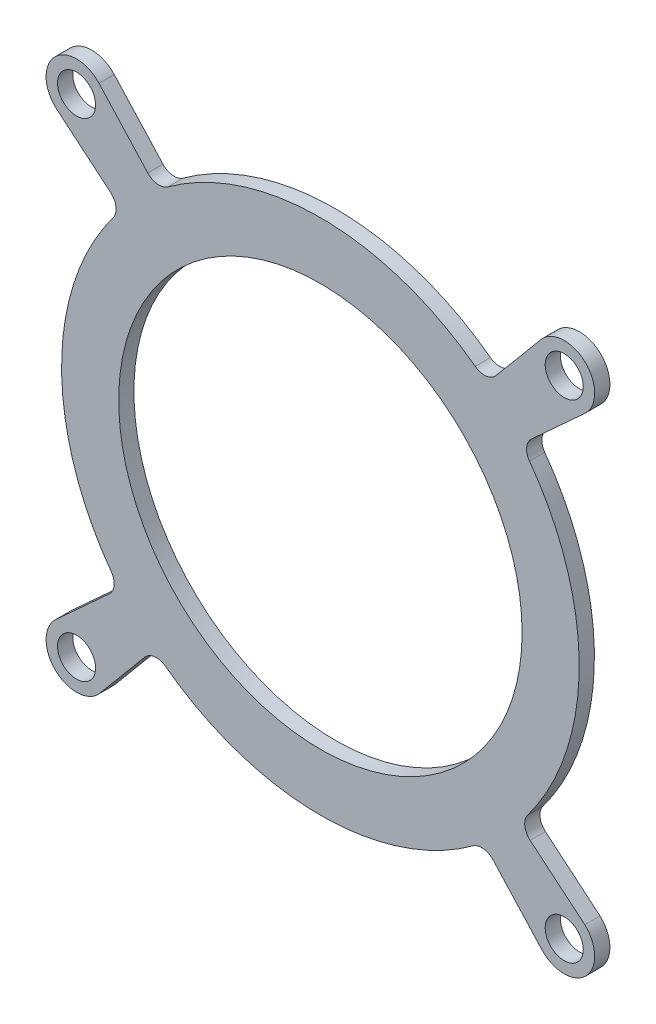
ISO-10303-21;
HEADER;
FILE_DESCRIPTION(('STEP AP214'),'2;1');
FILE_NAME('part.step','',(''),(''),'','','');
FILE_SCHEMA(('AUTOMOTIVE_DESIGN { 1 0 10303 214 1 1 1 1 }'));
ENDSEC;
DATA;
#1=APPLICATION_CONTEXT('core data for automotive mechanical design processes');
#2=APPLICATION_PROTOCOL_DEFINITION('international standard','automotive_design',2000,#1);
#3=PRODUCT_CONTEXT('',#1,'mechanical');
#4=PRODUCT('Part','Part','',(#3));
#5=PRODUCT_RELATED_PRODUCT_CATEGORY('part','',(#4));
#6=PRODUCT_DEFINITION_FORMATION('','',#4);
#7=PRODUCT_DEFINITION_CONTEXT('part definition',#1,'design');
#8=PRODUCT_DEFINITION('design','',#6,#7);
#9=PRODUCT_DEFINITION_SHAPE('','',#8);
#10=(LENGTH_UNIT() NAMED_UNIT(*) SI_UNIT(.MILLI.,.METRE.));
#11=(NAMED_UNIT(*) PLANE_ANGLE_UNIT() SI_UNIT($,.RADIAN.));
#12=(NAMED_UNIT(*) SI_UNIT($,.STERADIAN.) SOLID_ANGLE_UNIT());
#13=UNCERTAINTY_MEASURE_WITH_UNIT(LENGTH_MEASURE(1.E-05),#10,'distance_accuracy_value','');
#14=(GEOMETRIC_REPRESENTATION_CONTEXT(3) GLOBAL_UNCERTAINTY_ASSIGNED_CONTEXT((#13)) GLOBAL_UNIT_ASSIGNED_CONTEXT((#10,
#11,#12)) REPRESENTATION_CONTEXT('',''));
#15=CARTESIAN_POINT('',(0.,0.,0.));
#16=DIRECTION('',(0.,0.,1.));
#17=DIRECTION('',(1.,0.,0.));
#18=AXIS2_PLACEMENT_3D('',#15,#16,#17);
#19=CARTESIAN_POINT('',(32.0354727216565,-31.5983298645137,2.));
#20=DIRECTION('',(0.,0.,1.));
#21=DIRECTION('',(1.,0.,0.));
#22=AXIS2_PLACEMENT_3D('',#19,#20,#21);
#23=PLANE('',#22);
#24=CARTESIAN_POINT('',(32.0354727216543,32.4726155787952,2.));
#25=DIRECTION('',(0.,0.,1.));
#26=DIRECTION('',(1.,0.,0.));
#27=AXIS2_PLACEMENT_3D('',#24,#25,#26);
#28=CIRCLE('',#27,2.5000000000029);
#29=CARTESIAN_POINT('',(34.5354727216572,32.4726155787952,2.));
#30=VERTEX_POINT('',#29);
#31=EDGE_CURVE('E528',#30,#30,#28,.T.);
#32=ORIENTED_EDGE('',*,*,#31,.F.);
#33=EDGE_LOOP('',(#32));
#34=FACE_BOUND('',#33,.T.);
#35=CARTESIAN_POINT('',(-32.0354727216524,-31.5983298645159,2.));
#36=DIRECTION('',(0.,0.,1.));
#37=DIRECTION('',(1.,0.,0.));
#38=AXIS2_PLACEMENT_3D('',#35,#36,#37);
#39=CIRCLE('',#38,2.49999999999642);
#40=CARTESIAN_POINT('',(-29.535472721656,-31.5983298645159,2.));
#41=VERTEX_POINT('',#40);
#42=EDGE_CURVE('E544',#41,#41,#39,.T.);
#43=ORIENTED_EDGE('',*,*,#42,.F.);
#44=EDGE_LOOP('',(#43));
#45=FACE_BOUND('',#44,.T.);
#46=CARTESIAN_POINT('',(32.0354727216565,-31.5983298645137,2.));
#47=DIRECTION('',(0.,0.,1.));
#48=DIRECTION('',(1.,0.,0.));
#49=AXIS2_PLACEMENT_3D('',#46,#47,#48);
#50=CIRCLE('',#49,4.00000000000003);
#51=CARTESIAN_POINT('',(29.0849413750936,-34.2991380348491,2.));
#52=VERTEX_POINT('',#51);
#53=CARTESIAN_POINT('',(34.7362808919919,-28.6477985179509,2.));
#54=VERTEX_POINT('',#53);
#55=EDGE_CURVE('E308',#52,#54,#50,.T.);
#56=ORIENTED_EDGE('',*,*,#55,.T.);
#57=DIRECTION('',(-0.766720690696215,0.641980827173459,0.));
#58=VECTOR('',#57,1.);
#59=CARTESIAN_POINT('',(34.7362808919919,-28.6477985179509,2.));
#60=LINE('',#59,#58);
#61=CARTESIAN_POINT('',(27.5593163533478,-22.6384737572881,2.));
#62=VERTEX_POINT('',#61);
#63=EDGE_CURVE('E148',#54,#62,#60,.T.);
#64=ORIENTED_EDGE('',*,*,#63,.T.);
#65=CARTESIAN_POINT('',(28.8432780076946,-21.1050323758959,2.));
#66=DIRECTION('',(0.,0.,-1.));
#67=DIRECTION('',(-1.,0.,0.));
#68=AXIS2_PLACEMENT_3D('',#65,#66,#67);
#69=CIRCLE('',#68,1.99999999999966);
#70=CARTESIAN_POINT('',(27.2408736739341,-19.9082448629495,2.));
#71=VERTEX_POINT('',#70);
#72=EDGE_CURVE('E393',#62,#71,#69,.T.);
#73=ORIENTED_EDGE('',*,*,#72,.T.);
#74=CARTESIAN_POINT('',(9.99200722162641E-13,0.437142857142837,2.));
#75=DIRECTION('',(0.,0.,1.));
#76=DIRECTION('',(1.,0.,0.));
#77=AXIS2_PLACEMENT_3D('',#74,#75,#76);
#78=CIRCLE('',#77,34.000000000001);
#79=CARTESIAN_POINT('',(27.4749871011398,20.4652502013809,2.));
#80=VERTEX_POINT('',#79);
#81=EDGE_CURVE('E413',#71,#80,#78,.T.);
#82=ORIENTED_EDGE('',*,*,#81,.T.);
#83=CARTESIAN_POINT('',(29.0911628129714,21.6433741628067,2.));
#84=DIRECTION('',(0.,0.,-1.));
#85=DIRECTION('',(1.,0.,0.));
#86=AXIS2_PLACEMENT_3D('',#83,#84,#85);
#87=CIRCLE('',#86,1.99999999999999);
#88=CARTESIAN_POINT('',(27.7407587278038,23.1186398360881,2.));
#89=VERTEX_POINT('',#88);
#90=EDGE_CURVE('E409',#80,#89,#87,.T.);
#91=ORIENTED_EDGE('',*,*,#90,.T.);
#92=DIRECTION('',(0.7376328366407,0.675202042583843,0.));
#93=VECTOR('',#92,1.);
#94=CARTESIAN_POINT('',(34.7362808919891,29.5220842322318,2.));
#95=LINE('',#94,#93);
#96=CARTESIAN_POINT('',(34.7362808919891,29.5220842322318,2.));
#97=VERTEX_POINT('',#96);
#98=EDGE_CURVE('E412',#89,#97,#95,.T.);
#99=ORIENTED_EDGE('',*,*,#98,.T.);
#100=CARTESIAN_POINT('',(32.0354727216462,32.4726155787877,2.));
#101=DIRECTION('',(0.,0.,1.));
#102=DIRECTION('',(1.,0.,0.));
#103=AXIS2_PLACEMENT_3D('',#100,#101,#102);
#104=CIRCLE('',#103,4.00000000000003);
#105=CARTESIAN_POINT('',(29.0849413750908,35.1734237491312,2.));
#106=VERTEX_POINT('',#105);
#107=EDGE_CURVE('E417',#97,#106,#104,.T.);
#108=ORIENTED_EDGE('',*,*,#107,.T.);
#109=DIRECTION('',(-0.641980827173504,-0.766720690696178,0.));
#110=VECTOR('',#109,1.);
#111=CARTESIAN_POINT('',(29.0849413750908,35.1734237491312,2.));
#112=LINE('',#111,#110);
#113=CARTESIAN_POINT('',(23.0756166144313,27.9964592104921,2.));
#114=VERTEX_POINT('',#113);
#115=EDGE_CURVE('E424',#106,#114,#112,.T.);
#116=ORIENTED_EDGE('',*,*,#115,.T.);
#117=CARTESIAN_POINT('',(21.5421752330389,29.280420864839,2.));
#118=DIRECTION('',(0.,0.,-1.));
#119=DIRECTION('',(-1.,0.,0.));
#120=AXIS2_PLACEMENT_3D('',#117,#118,#119);
#121=CIRCLE('',#120,2.);
#122=CARTESIAN_POINT('',(20.3453877200923,27.6780165310783,2.));
#123=VERTEX_POINT('',#122);
#124=EDGE_CURVE('E427',#114,#123,#121,.T.);
#125=ORIENTED_EDGE('',*,*,#124,.T.);
#126=CARTESIAN_POINT('',(3.23767156700697E-13,0.437142857144609,2.));
#127=DIRECTION('',(0.,0.,1.));
#128=DIRECTION('',(1.,0.,0.));
#129=AXIS2_PLACEMENT_3D('',#126,#127,#128);
#130=CIRCLE('',#129,34.0000000000012);
#131=CARTESIAN_POINT('',(-20.0281073442409,27.9121299582814,2.));
#132=VERTEX_POINT('',#131);
#133=EDGE_CURVE('E430',#123,#132,#130,.T.);
#134=ORIENTED_EDGE('',*,*,#133,.T.);
#135=CARTESIAN_POINT('',(-21.2062313056668,29.5283056701129,2.));
#136=DIRECTION('',(0.,0.,-1.));
#137=DIRECTION('',(1.,0.,0.));
#138=AXIS2_PLACEMENT_3D('',#135,#136,#137);
#139=CIRCLE('',#138,1.99999999999998);
#140=CARTESIAN_POINT('',(-22.6814969789482,28.1779015849453,2.));
#141=VERTEX_POINT('',#140);
#142=EDGE_CURVE('E433',#132,#141,#139,.T.);
#143=ORIENTED_EDGE('',*,*,#142,.T.);
#144=DIRECTION('',(-0.675202042583903,0.737632836640645,0.));
#145=VECTOR('',#144,1.);
#146=CARTESIAN_POINT('',(-29.0849413750926,35.1734237491302,2.));
#147=LINE('',#146,#145);
#148=CARTESIAN_POINT('',(-29.0849413750925,35.1734237491302,2.));
#149=VERTEX_POINT('',#148);
#150=EDGE_CURVE('E436',#141,#149,#147,.T.);
#151=ORIENTED_EDGE('',*,*,#150,.T.);
#152=CARTESIAN_POINT('',(-32.035472721681,32.4726155788198,2.));
#153=DIRECTION('',(0.,0.,1.));
#154=DIRECTION('',(1.,0.,0.));
#155=AXIS2_PLACEMENT_3D('',#152,#153,#154);
#156=CIRCLE('',#155,4.00000000000205);
#157=CARTESIAN_POINT('',(-34.7362808919923,29.5220842322322,2.));
#158=VERTEX_POINT('',#157);
#159=EDGE_CURVE('E439',#149,#158,#156,.T.);
#160=ORIENTED_EDGE('',*,*,#159,.T.);
#161=DIRECTION('',(0.76672069069621,-0.641980827173466,0.));
#162=VECTOR('',#161,1.);
#163=CARTESIAN_POINT('',(-34.7362808919923,29.5220842322322,2.));
#164=LINE('',#163,#162);
#165=CARTESIAN_POINT('',(-27.5593163533485,23.5127594715695,2.));
#166=VERTEX_POINT('',#165);
#167=EDGE_CURVE('E442',#158,#166,#164,.T.);
#168=ORIENTED_EDGE('',*,*,#167,.T.);
#169=CARTESIAN_POINT('',(-28.8432780076955,21.9793180901771,2.));
#170=DIRECTION('',(0.,0.,-1.));
#171=DIRECTION('',(-1.,0.,0.));
#172=AXIS2_PLACEMENT_3D('',#169,#170,#171);
#173=CIRCLE('',#172,2.00000000000002);
#174=CARTESIAN_POINT('',(-27.2408736739342,20.7825305772304,2.));
#175=VERTEX_POINT('',#174);
#176=EDGE_CURVE('E445',#166,#175,#173,.T.);
#177=ORIENTED_EDGE('',*,*,#176,.T.);
#178=CARTESIAN_POINT('',(7.35522753814166E-13,0.437142857142837,2.));
#179=DIRECTION('',(0.,0.,1.));
#180=DIRECTION('',(1.,0.,0.));
#181=AXIS2_PLACEMENT_3D('',#178,#179,#180);
#182=CIRCLE('',#181,33.9999999999996);
#183=CARTESIAN_POINT('',(-27.474987101134,-19.5909644870978,2.));
#184=VERTEX_POINT('',#183);
#185=EDGE_CURVE('E448',#175,#184,#182,.T.);
#186=ORIENTED_EDGE('',*,*,#185,.T.);
#187=CARTESIAN_POINT('',(-29.0911628129655,-20.7690884485238,2.));
#188=DIRECTION('',(0.,0.,-1.));
#189=DIRECTION('',(1.,0.,0.));
#190=AXIS2_PLACEMENT_3D('',#187,#188,#189);
#191=CIRCLE('',#190,2.);
#192=CARTESIAN_POINT('',(-27.7407587277978,-22.2443541218052,2.));
#193=VERTEX_POINT('',#192);
#194=EDGE_CURVE('E451',#184,#193,#191,.T.);
#195=ORIENTED_EDGE('',*,*,#194,.T.);
#196=DIRECTION('',(-0.737632836640711,-0.675202042583831,0.));
#197=VECTOR('',#196,1.);
#198=CARTESIAN_POINT('',(-34.7362808919889,-28.647798517954,2.));
#199=LINE('',#198,#197);
#200=CARTESIAN_POINT('',(-34.7362808919889,-28.6477985179541,2.));
#201=VERTEX_POINT('',#200);
#202=EDGE_CURVE('E454',#193,#201,#199,.T.);
#203=ORIENTED_EDGE('',*,*,#202,.T.);
#204=CARTESIAN_POINT('',(-32.0354727216524,-31.5983298645159,2.));
#205=DIRECTION('',(0.,0.,1.));
#206=DIRECTION('',(1.,0.,0.));
#207=AXIS2_PLACEMENT_3D('',#204,#205,#206);
#208=CIRCLE('',#207,4.00000000000007);
#209=CARTESIAN_POINT('',(-29.0849413750896,-34.2991380348513,2.));
#210=VERTEX_POINT('',#209);
#211=EDGE_CURVE('E457',#201,#210,#208,.T.);
#212=ORIENTED_EDGE('',*,*,#211,.T.);
#213=DIRECTION('',(0.641980827173464,0.766720690696211,0.));
#214=VECTOR('',#213,1.);
#215=CARTESIAN_POINT('',(-29.0849413750896,-34.2991380348513,2.));
#216=LINE('',#215,#214);
#217=CARTESIAN_POINT('',(-23.0756166144263,-27.1221734962068,2.));
#218=VERTEX_POINT('',#217);
#219=EDGE_CURVE('E460',#210,#218,#216,.T.);
#220=ORIENTED_EDGE('',*,*,#219,.T.);
#221=CARTESIAN_POINT('',(-21.5421752330338,-28.4061351505537,2.));
#222=DIRECTION('',(0.,0.,-1.));
#223=DIRECTION('',(-1.,0.,0.));
#224=AXIS2_PLACEMENT_3D('',#221,#222,#223);
#225=CIRCLE('',#224,2.00000000000001);
#226=CARTESIAN_POINT('',(-20.3453877200875,-26.8037308167928,2.));
#227=VERTEX_POINT('',#226);
#228=EDGE_CURVE('E215',#218,#227,#225,.T.);
#229=ORIENTED_EDGE('',*,*,#228,.T.);
#230=CARTESIAN_POINT('',(0.,0.437142857143018,2.));
#231=DIRECTION('',(0.,0.,1.));
#232=DIRECTION('',(1.,0.,0.));
#233=AXIS2_PLACEMENT_3D('',#230,#231,#232);
#234=CIRCLE('',#233,34.0000000000002);
#235=CARTESIAN_POINT('',(20.0281073442381,-27.0378442439947,2.));
#236=VERTEX_POINT('',#235);
#237=EDGE_CURVE('E209',#227,#236,#234,.T.);
#238=ORIENTED_EDGE('',*,*,#237,.T.);
#239=CARTESIAN_POINT('',(21.2062313056639,-28.6540199558263,2.));
#240=DIRECTION('',(0.,0.,-1.));
#241=DIRECTION('',(1.,0.,0.));
#242=AXIS2_PLACEMENT_3D('',#239,#240,#241);
#243=CIRCLE('',#242,2.);
#244=CARTESIAN_POINT('',(22.6814969789453,-27.3036158706586,2.));
#245=VERTEX_POINT('',#244);
#246=EDGE_CURVE('E213',#236,#245,#243,.T.);
#247=ORIENTED_EDGE('',*,*,#246,.T.);
#248=DIRECTION('',(0.675202042583839,-0.737632836640704,0.));
#249=VECTOR('',#248,1.);
#250=CARTESIAN_POINT('',(29.0849413750936,-34.2991380348491,2.));
#251=LINE('',#250,#249);
#252=EDGE_CURVE('E57',#245,#52,#251,.T.);
#253=ORIENTED_EDGE('',*,*,#252,.T.);
#254=EDGE_LOOP('',(#56,#64,#73,#82,#91,#99,#108,#116,#125,#134,#143,#151,#160,#168,#177,#186,
#195,#203,#212,#220,#229,#238,#247,#253));
#255=FACE_BOUND('',#254,.T.);
#256=CARTESIAN_POINT('',(32.0354727216565,-31.5983298645137,2.));
#257=DIRECTION('',(0.,0.,1.));
#258=DIRECTION('',(1.,0.,0.));
#259=AXIS2_PLACEMENT_3D('',#256,#257,#258);
#260=CIRCLE('',#259,2.5);
#261=CARTESIAN_POINT('',(34.5354727216565,-31.5983298645137,2.));
#262=VERTEX_POINT('',#261);
#263=EDGE_CURVE('E242',#262,#262,#260,.T.);
#264=ORIENTED_EDGE('',*,*,#263,.F.);
#265=EDGE_LOOP('',(#264));
#266=FACE_BOUND('',#265,.T.);
#267=CARTESIAN_POINT('',(-32.0354727216546,32.4726155787929,2.));
#268=DIRECTION('',(0.,0.,1.));
#269=DIRECTION('',(1.,0.,0.));
#270=AXIS2_PLACEMENT_3D('',#267,#268,#269);
#271=CIRCLE('',#270,2.4999999999996);
#272=CARTESIAN_POINT('',(-29.535472721655,32.4726155787929,2.));
#273=VERTEX_POINT('',#272);
#274=EDGE_CURVE('E536',#273,#273,#271,.T.);
#275=ORIENTED_EDGE('',*,*,#274,.F.);
#276=EDGE_LOOP('',(#275));
#277=FACE_BOUND('',#276,.T.);
#278=CARTESIAN_POINT('',(3.23767156700697E-13,0.437142857144609,2.));
#279=DIRECTION('',(0.,0.,1.));
#280=DIRECTION('',(1.,0.,0.));
#281=AXIS2_PLACEMENT_3D('',#278,#279,#280);
#282=CIRCLE('',#281,26.5);
#283=CARTESIAN_POINT('',(26.5000000000003,0.437142857144609,2.));
#284=VERTEX_POINT('',#283);
#285=EDGE_CURVE('E517',#284,#284,#282,.T.);
#286=ORIENTED_EDGE('',*,*,#285,.F.);
#287=EDGE_LOOP('',(#286));
#288=FACE_BOUND('',#287,.T.);
#289=ADVANCED_FACE('F39',(#34,#45,#255,#266,#277,#288),#23,.T.);
#290=CARTESIAN_POINT('',(32.0354727216565,-31.5983298645137,0.));
#291=DIRECTION('',(0.,0.,1.));
#292=DIRECTION('',(1.,0.,0.));
#293=AXIS2_PLACEMENT_3D('',#290,#291,#292);
#294=PLANE('',#293);
#295=CARTESIAN_POINT('',(32.0354727216565,-31.5983298645137,0.));
#296=DIRECTION('',(0.,0.,1.));
#297=DIRECTION('',(1.,0.,0.));
#298=AXIS2_PLACEMENT_3D('',#295,#296,#297);
#299=CIRCLE('',#298,4.00000000000003);
#300=CARTESIAN_POINT('',(29.0849413750936,-34.2991380348491,0.));
#301=VERTEX_POINT('',#300);
#302=CARTESIAN_POINT('',(34.7362808919919,-28.6477985179509,0.));
#303=VERTEX_POINT('',#302);
#304=EDGE_CURVE('E237',#301,#303,#299,.T.);
#305=ORIENTED_EDGE('',*,*,#304,.F.);
#306=DIRECTION('',(0.675202042583839,-0.737632836640704,0.));
#307=VECTOR('',#306,1.);
#308=CARTESIAN_POINT('',(29.0849413750936,-34.2991380348491,0.));
#309=LINE('',#308,#307);
#310=CARTESIAN_POINT('',(22.6814969789453,-27.3036158706586,0.));
#311=VERTEX_POINT('',#310);
#312=EDGE_CURVE('E140',#311,#301,#309,.T.);
#313=ORIENTED_EDGE('',*,*,#312,.F.);
#314=CARTESIAN_POINT('',(21.2062313056639,-28.6540199558263,0.));
#315=DIRECTION('',(0.,0.,-1.));
#316=DIRECTION('',(1.,0.,0.));
#317=AXIS2_PLACEMENT_3D('',#314,#315,#316);
#318=CIRCLE('',#317,2.);
#319=CARTESIAN_POINT('',(20.0281073442381,-27.0378442439947,0.));
#320=VERTEX_POINT('',#319);
#321=EDGE_CURVE('E134',#320,#311,#318,.T.);
#322=ORIENTED_EDGE('',*,*,#321,.F.);
#323=CARTESIAN_POINT('',(0.,0.437142857143018,0.));
#324=DIRECTION('',(0.,0.,1.));
#325=DIRECTION('',(1.,0.,0.));
#326=AXIS2_PLACEMENT_3D('',#323,#324,#325);
#327=CIRCLE('',#326,34.0000000000002);
#328=CARTESIAN_POINT('',(-20.3453877200875,-26.8037308167928,0.));
#329=VERTEX_POINT('',#328);
#330=EDGE_CURVE('E224',#329,#320,#327,.T.);
#331=ORIENTED_EDGE('',*,*,#330,.F.);
#332=CARTESIAN_POINT('',(-21.5421752330338,-28.4061351505537,0.));
#333=DIRECTION('',(0.,0.,-1.));
#334=DIRECTION('',(-1.,0.,0.));
#335=AXIS2_PLACEMENT_3D('',#332,#333,#334);
#336=CIRCLE('',#335,2.00000000000001);
#337=CARTESIAN_POINT('',(-23.0756166144263,-27.1221734962068,0.));
#338=VERTEX_POINT('',#337);
#339=EDGE_CURVE('E299',#338,#329,#336,.T.);
#340=ORIENTED_EDGE('',*,*,#339,.F.);
#341=DIRECTION('',(0.641980827173464,0.766720690696211,0.));
#342=VECTOR('',#341,1.);
#343=CARTESIAN_POINT('',(-29.0849413750896,-34.2991380348513,0.));
#344=LINE('',#343,#342);
#345=CARTESIAN_POINT('',(-29.0849413750896,-34.2991380348513,0.));
#346=VERTEX_POINT('',#345);
#347=EDGE_CURVE('E296',#346,#338,#344,.T.);
#348=ORIENTED_EDGE('',*,*,#347,.F.);
#349=CARTESIAN_POINT('',(-32.0354727216524,-31.5983298645159,0.));
#350=DIRECTION('',(0.,0.,1.));
#351=DIRECTION('',(1.,0.,0.));
#352=AXIS2_PLACEMENT_3D('',#349,#350,#351);
#353=CIRCLE('',#352,4.00000000000007);
#354=CARTESIAN_POINT('',(-34.7362808919889,-28.6477985179541,0.));
#355=VERTEX_POINT('',#354);
#356=EDGE_CURVE('E293',#355,#346,#353,.T.);
#357=ORIENTED_EDGE('',*,*,#356,.F.);
#358=DIRECTION('',(-0.737632836640711,-0.675202042583831,0.));
#359=VECTOR('',#358,1.);
#360=CARTESIAN_POINT('',(-34.7362808919889,-28.647798517954,0.));
#361=LINE('',#360,#359);
#362=CARTESIAN_POINT('',(-27.7407587277978,-22.2443541218052,0.));
#363=VERTEX_POINT('',#362);
#364=EDGE_CURVE('E290',#363,#355,#361,.T.);
#365=ORIENTED_EDGE('',*,*,#364,.F.);
#366=CARTESIAN_POINT('',(-29.0911628129655,-20.7690884485238,0.));
#367=DIRECTION('',(0.,0.,-1.));
#368=DIRECTION('',(1.,0.,0.));
#369=AXIS2_PLACEMENT_3D('',#366,#367,#368);
#370=CIRCLE('',#369,2.);
#371=CARTESIAN_POINT('',(-27.474987101134,-19.5909644870978,0.));
#372=VERTEX_POINT('',#371);
#373=EDGE_CURVE('E287',#372,#363,#370,.T.);
#374=ORIENTED_EDGE('',*,*,#373,.F.);
#375=CARTESIAN_POINT('',(7.35522753814166E-13,0.437142857142837,0.));
#376=DIRECTION('',(0.,0.,1.));
#377=DIRECTION('',(1.,0.,0.));
#378=AXIS2_PLACEMENT_3D('',#375,#376,#377);
#379=CIRCLE('',#378,33.9999999999996);
#380=CARTESIAN_POINT('',(-27.2408736739342,20.7825305772304,0.));
#381=VERTEX_POINT('',#380);
#382=EDGE_CURVE('E284',#381,#372,#379,.T.);
#383=ORIENTED_EDGE('',*,*,#382,.F.);
#384=CARTESIAN_POINT('',(-28.8432780076955,21.9793180901771,0.));
#385=DIRECTION('',(0.,0.,-1.));
#386=DIRECTION('',(-1.,0.,0.));
#387=AXIS2_PLACEMENT_3D('',#384,#385,#386);
#388=CIRCLE('',#387,2.00000000000002);
#389=CARTESIAN_POINT('',(-27.5593163533485,23.5127594715695,0.));
#390=VERTEX_POINT('',#389);
#391=EDGE_CURVE('E281',#390,#381,#388,.T.);
#392=ORIENTED_EDGE('',*,*,#391,.F.);
#393=DIRECTION('',(0.76672069069621,-0.641980827173466,0.));
#394=VECTOR('',#393,1.);
#395=CARTESIAN_POINT('',(-34.7362808919923,29.5220842322322,0.));
#396=LINE('',#395,#394);
#397=CARTESIAN_POINT('',(-34.7362808919923,29.5220842322322,0.));
#398=VERTEX_POINT('',#397);
#399=EDGE_CURVE('E278',#398,#390,#396,.T.);
#400=ORIENTED_EDGE('',*,*,#399,.F.);
#401=CARTESIAN_POINT('',(-32.035472721681,32.4726155788198,0.));
#402=DIRECTION('',(0.,0.,1.));
#403=DIRECTION('',(1.,0.,0.));
#404=AXIS2_PLACEMENT_3D('',#401,#402,#403);
#405=CIRCLE('',#404,4.00000000000205);
#406=CARTESIAN_POINT('',(-29.0849413750925,35.1734237491302,0.));
#407=VERTEX_POINT('',#406);
#408=EDGE_CURVE('E275',#407,#398,#405,.T.);
#409=ORIENTED_EDGE('',*,*,#408,.F.);
#410=DIRECTION('',(-0.675202042583903,0.737632836640645,0.));
#411=VECTOR('',#410,1.);
#412=CARTESIAN_POINT('',(-29.0849413750926,35.1734237491302,0.));
#413=LINE('',#412,#411);
#414=CARTESIAN_POINT('',(-22.6814969789482,28.1779015849453,0.));
#415=VERTEX_POINT('',#414);
#416=EDGE_CURVE('E272',#415,#407,#413,.T.);
#417=ORIENTED_EDGE('',*,*,#416,.F.);
#418=CARTESIAN_POINT('',(-21.2062313056668,29.5283056701129,0.));
#419=DIRECTION('',(0.,0.,-1.));
#420=DIRECTION('',(1.,0.,0.));
#421=AXIS2_PLACEMENT_3D('',#418,#419,#420);
#422=CIRCLE('',#421,1.99999999999998);
#423=CARTESIAN_POINT('',(-20.0281073442409,27.9121299582814,0.));
#424=VERTEX_POINT('',#423);
#425=EDGE_CURVE('E269',#424,#415,#422,.T.);
#426=ORIENTED_EDGE('',*,*,#425,.F.);
#427=CARTESIAN_POINT('',(3.23767156700697E-13,0.437142857144609,0.));
#428=DIRECTION('',(0.,0.,1.));
#429=DIRECTION('',(1.,0.,0.));
#430=AXIS2_PLACEMENT_3D('',#427,#428,#429);
#431=CIRCLE('',#430,34.0000000000012);
#432=CARTESIAN_POINT('',(20.3453877200923,27.6780165310783,0.));
#433=VERTEX_POINT('',#432);
#434=EDGE_CURVE('E266',#433,#424,#431,.T.);
#435=ORIENTED_EDGE('',*,*,#434,.F.);
#436=CARTESIAN_POINT('',(21.5421752330389,29.280420864839,0.));
#437=DIRECTION('',(0.,0.,-1.));
#438=DIRECTION('',(-1.,0.,0.));
#439=AXIS2_PLACEMENT_3D('',#436,#437,#438);
#440=CIRCLE('',#439,2.);
#441=CARTESIAN_POINT('',(23.0756166144313,27.9964592104921,0.));
#442=VERTEX_POINT('',#441);
#443=EDGE_CURVE('E263',#442,#433,#440,.T.);
#444=ORIENTED_EDGE('',*,*,#443,.F.);
#445=DIRECTION('',(-0.641980827173504,-0.766720690696178,0.));
#446=VECTOR('',#445,1.);
#447=CARTESIAN_POINT('',(29.0849413750908,35.1734237491312,0.));
#448=LINE('',#447,#446);
#449=CARTESIAN_POINT('',(29.0849413750908,35.1734237491312,0.));
#450=VERTEX_POINT('',#449);
#451=EDGE_CURVE('E260',#450,#442,#448,.T.);
#452=ORIENTED_EDGE('',*,*,#451,.F.);
#453=CARTESIAN_POINT('',(32.0354727216462,32.4726155787877,0.));
#454=DIRECTION('',(0.,0.,1.));
#455=DIRECTION('',(1.,0.,0.));
#456=AXIS2_PLACEMENT_3D('',#453,#454,#455);
#457=CIRCLE('',#456,4.00000000000003);
#458=CARTESIAN_POINT('',(34.7362808919891,29.5220842322318,0.));
#459=VERTEX_POINT('',#458);
#460=EDGE_CURVE('E257',#459,#450,#457,.T.);
#461=ORIENTED_EDGE('',*,*,#460,.F.);
#462=DIRECTION('',(0.7376328366407,0.675202042583843,0.));
#463=VECTOR('',#462,1.);
#464=CARTESIAN_POINT('',(34.7362808919891,29.5220842322318,0.));
#465=LINE('',#464,#463);
#466=CARTESIAN_POINT('',(27.7407587278038,23.1186398360881,0.));
#467=VERTEX_POINT('',#466);
#468=EDGE_CURVE('E254',#467,#459,#465,.T.);
#469=ORIENTED_EDGE('',*,*,#468,.F.);
#470=CARTESIAN_POINT('',(29.0911628129714,21.6433741628067,0.));
#471=DIRECTION('',(0.,0.,-1.));
#472=DIRECTION('',(1.,0.,0.));
#473=AXIS2_PLACEMENT_3D('',#470,#471,#472);
#474=CIRCLE('',#473,1.99999999999999);
#475=CARTESIAN_POINT('',(27.4749871011398,20.4652502013809,0.));
#476=VERTEX_POINT('',#475);
#477=EDGE_CURVE('E251',#476,#467,#474,.T.);
#478=ORIENTED_EDGE('',*,*,#477,.F.);
#479=CARTESIAN_POINT('',(9.99200722162641E-13,0.437142857142837,0.));
#480=DIRECTION('',(0.,0.,1.));
#481=DIRECTION('',(1.,0.,0.));
#482=AXIS2_PLACEMENT_3D('',#479,#480,#481);
#483=CIRCLE('',#482,34.000000000001);
#484=CARTESIAN_POINT('',(27.2408736739341,-19.9082448629495,0.));
#485=VERTEX_POINT('',#484);
#486=EDGE_CURVE('E248',#485,#476,#483,.T.);
#487=ORIENTED_EDGE('',*,*,#486,.F.);
#488=CARTESIAN_POINT('',(28.8432780076946,-21.1050323758959,0.));
#489=DIRECTION('',(0.,0.,-1.));
#490=DIRECTION('',(-1.,0.,0.));
#491=AXIS2_PLACEMENT_3D('',#488,#489,#490);
#492=CIRCLE('',#491,1.99999999999966);
#493=CARTESIAN_POINT('',(27.5593163533478,-22.6384737572881,0.));
#494=VERTEX_POINT('',#493);
#495=EDGE_CURVE('E245',#494,#485,#492,.T.);
#496=ORIENTED_EDGE('',*,*,#495,.F.);
#497=DIRECTION('',(-0.766720690696215,0.641980827173459,0.));
#498=VECTOR('',#497,1.);
#499=CARTESIAN_POINT('',(34.7362808919919,-28.6477985179509,0.));
#500=LINE('',#499,#498);
#501=EDGE_CURVE('E241',#303,#494,#500,.T.);
#502=ORIENTED_EDGE('',*,*,#501,.F.);
#503=EDGE_LOOP('',(#305,#313,#322,#331,#340,#348,#357,#365,#374,#383,#392,#400,#409,#417,#426,
#435,#444,#452,#461,#469,#478,#487,#496,#502));
#504=FACE_BOUND('',#503,.T.);
#505=CARTESIAN_POINT('',(32.0354727216565,-31.5983298645137,0.));
#506=DIRECTION('',(0.,0.,1.));
#507=DIRECTION('',(1.,0.,0.));
#508=AXIS2_PLACEMENT_3D('',#505,#506,#507);
#509=CIRCLE('',#508,2.5);
#510=CARTESIAN_POINT('',(34.5354727216565,-31.5983298645137,0.));
#511=VERTEX_POINT('',#510);
#512=EDGE_CURVE('E548',#511,#511,#509,.T.);
#513=ORIENTED_EDGE('',*,*,#512,.T.);
#514=EDGE_LOOP('',(#513));
#515=FACE_BOUND('',#514,.T.);
#516=CARTESIAN_POINT('',(-32.0354727216524,-31.5983298645159,0.));
#517=DIRECTION('',(0.,0.,1.));
#518=DIRECTION('',(1.,0.,0.));
#519=AXIS2_PLACEMENT_3D('',#516,#517,#518);
#520=CIRCLE('',#519,2.49999999999642);
#521=CARTESIAN_POINT('',(-29.535472721656,-31.5983298645159,0.));
#522=VERTEX_POINT('',#521);
#523=EDGE_CURVE('E540',#522,#522,#520,.T.);
#524=ORIENTED_EDGE('',*,*,#523,.T.);
#525=EDGE_LOOP('',(#524));
#526=FACE_BOUND('',#525,.T.);
#527=CARTESIAN_POINT('',(-32.0354727216546,32.4726155787929,0.));
#528=DIRECTION('',(0.,0.,1.));
#529=DIRECTION('',(1.,0.,0.));
#530=AXIS2_PLACEMENT_3D('',#527,#528,#529);
#531=CIRCLE('',#530,2.4999999999996);
#532=CARTESIAN_POINT('',(-29.535472721655,32.4726155787929,0.));
#533=VERTEX_POINT('',#532);
#534=EDGE_CURVE('E532',#533,#533,#531,.T.);
#535=ORIENTED_EDGE('',*,*,#534,.T.);
#536=EDGE_LOOP('',(#535));
#537=FACE_BOUND('',#536,.T.);
#538=CARTESIAN_POINT('',(32.0354727216543,32.4726155787952,0.));
#539=DIRECTION('',(0.,0.,1.));
#540=DIRECTION('',(1.,0.,0.));
#541=AXIS2_PLACEMENT_3D('',#538,#539,#540);
#542=CIRCLE('',#541,2.5000000000029);
#543=CARTESIAN_POINT('',(34.5354727216572,32.4726155787952,0.));
#544=VERTEX_POINT('',#543);
#545=EDGE_CURVE('E525',#544,#544,#542,.T.);
#546=ORIENTED_EDGE('',*,*,#545,.T.);
#547=EDGE_LOOP('',(#546));
#548=FACE_BOUND('',#547,.T.);
#549=CARTESIAN_POINT('',(3.23767156700697E-13,0.437142857144609,0.));
#550=DIRECTION('',(0.,0.,1.));
#551=DIRECTION('',(1.,0.,0.));
#552=AXIS2_PLACEMENT_3D('',#549,#550,#551);
#553=CIRCLE('',#552,26.5);
#554=CARTESIAN_POINT('',(26.5000000000003,0.437142857144609,0.));
#555=VERTEX_POINT('',#554);
#556=EDGE_CURVE('E520',#555,#555,#553,.T.);
#557=ORIENTED_EDGE('',*,*,#556,.T.);
#558=EDGE_LOOP('',(#557));
#559=FACE_BOUND('',#558,.T.);
#560=ADVANCED_FACE('F397',(#504,#515,#526,#537,#548,#559),#294,.F.);
#561=CARTESIAN_POINT('',(32.0354727216565,-31.5983298645137,2.));
#562=DIRECTION('',(0.,0.,-1.));
#563=DIRECTION('',(-1.,0.,0.));
#564=AXIS2_PLACEMENT_3D('',#561,#562,#563);
#565=CYLINDRICAL_SURFACE('',#564,4.00000000000003);
#566=ORIENTED_EDGE('',*,*,#304,.T.);
#567=DIRECTION('',(0.,0.,-1.));
#568=VECTOR('',#567,1.);
#569=CARTESIAN_POINT('',(34.7362808919919,-28.6477985179509,2.));
#570=LINE('',#569,#568);
#571=EDGE_CURVE('E11',#54,#303,#570,.T.);
#572=ORIENTED_EDGE('',*,*,#571,.F.);
#573=ORIENTED_EDGE('',*,*,#55,.F.);
#574=DIRECTION('',(0.,0.,-1.));
#575=VECTOR('',#574,1.);
#576=CARTESIAN_POINT('',(29.0849413750936,-34.2991380348491,2.));
#577=LINE('',#576,#575);
#578=EDGE_CURVE('E233',#52,#301,#577,.T.);
#579=ORIENTED_EDGE('',*,*,#578,.T.);
#580=EDGE_LOOP('',(#566,#572,#573,#579));
#581=FACE_BOUND('',#580,.T.);
#582=ADVANCED_FACE('F41',(#581),#565,.T.);
#583=CARTESIAN_POINT('',(34.7362808919919,-28.6477985179509,2.));
#584=DIRECTION('',(-0.641980827173459,-0.766720690696215,0.));
#585=DIRECTION('',(0.766720690696215,-0.641980827173459,0.));
#586=AXIS2_PLACEMENT_3D('',#583,#584,#585);
#587=PLANE('',#586);
#588=ORIENTED_EDGE('',*,*,#501,.T.);
#589=DIRECTION('',(0.,0.,-1.));
#590=VECTOR('',#589,1.);
#591=CARTESIAN_POINT('',(27.5593163533478,-22.6384737572881,2.));
#592=LINE('',#591,#590);
#593=EDGE_CURVE('E49',#62,#494,#592,.T.);
#594=ORIENTED_EDGE('',*,*,#593,.F.);
#595=ORIENTED_EDGE('',*,*,#63,.F.);
#596=ORIENTED_EDGE('',*,*,#571,.T.);
#597=EDGE_LOOP('',(#588,#594,#595,#596));
#598=FACE_BOUND('',#597,.T.);
#599=ADVANCED_FACE('F793',(#598),#587,.F.);
#600=CARTESIAN_POINT('',(28.8432780076946,-21.1050323758959,2.));
#601=DIRECTION('',(0.,0.,-1.));
#602=DIRECTION('',(-1.,0.,0.));
#603=AXIS2_PLACEMENT_3D('',#600,#601,#602);
#604=CYLINDRICAL_SURFACE('',#603,1.99999999999966);
#605=ORIENTED_EDGE('',*,*,#495,.T.);
#606=DIRECTION('',(0.,0.,-1.));
#607=VECTOR('',#606,1.);
#608=CARTESIAN_POINT('',(27.2408736739341,-19.9082448629495,2.));
#609=LINE('',#608,#607);
#610=EDGE_CURVE('E383',#71,#485,#609,.T.);
#611=ORIENTED_EDGE('',*,*,#610,.F.);
#612=ORIENTED_EDGE('',*,*,#72,.F.);
#613=ORIENTED_EDGE('',*,*,#593,.T.);
#614=EDGE_LOOP('',(#605,#611,#612,#613));
#615=FACE_BOUND('',#614,.T.);
#616=ADVANCED_FACE('F391',(#615),#604,.F.);
#617=CARTESIAN_POINT('',(9.99200722162641E-13,0.437142857142837,2.));
#618=DIRECTION('',(0.,0.,-1.));
#619=DIRECTION('',(-1.,0.,0.));
#620=AXIS2_PLACEMENT_3D('',#617,#618,#619);
#621=CYLINDRICAL_SURFACE('',#620,34.000000000001);
#622=ORIENTED_EDGE('',*,*,#486,.T.);
#623=DIRECTION('',(0.,0.,-1.));
#624=VECTOR('',#623,1.);
#625=CARTESIAN_POINT('',(27.4749871011398,20.4652502013809,2.));
#626=LINE('',#625,#624);
#627=EDGE_CURVE('E379',#80,#476,#626,.T.);
#628=ORIENTED_EDGE('',*,*,#627,.F.);
#629=ORIENTED_EDGE('',*,*,#81,.F.);
#630=ORIENTED_EDGE('',*,*,#610,.T.);
#631=EDGE_LOOP('',(#622,#628,#629,#630));
#632=FACE_BOUND('',#631,.T.);
#633=ADVANCED_FACE('F403',(#632),#621,.T.);
#634=CARTESIAN_POINT('',(29.0911628129714,21.6433741628067,2.));
#635=DIRECTION('',(0.,0.,-1.));
#636=DIRECTION('',(-1.,0.,0.));
#637=AXIS2_PLACEMENT_3D('',#634,#635,#636);
#638=CYLINDRICAL_SURFACE('',#637,1.99999999999999);
#639=ORIENTED_EDGE('',*,*,#477,.T.);
#640=DIRECTION('',(0.,0.,-1.));
#641=VECTOR('',#640,1.);
#642=CARTESIAN_POINT('',(27.7407587278038,23.1186398360881,2.));
#643=LINE('',#642,#641);
#644=EDGE_CURVE('E375',#89,#467,#643,.T.);
#645=ORIENTED_EDGE('',*,*,#644,.F.);
#646=ORIENTED_EDGE('',*,*,#90,.F.);
#647=ORIENTED_EDGE('',*,*,#627,.T.);
#648=EDGE_LOOP('',(#639,#645,#646,#647));
#649=FACE_BOUND('',#648,.T.);
#650=ADVANCED_FACE('F407',(#649),#638,.F.);
#651=CARTESIAN_POINT('',(34.7362808919891,29.5220842322318,2.));
#652=DIRECTION('',(-0.675202042583843,0.7376328366407,0.));
#653=DIRECTION('',(-0.7376328366407,-0.675202042583843,0.));
#654=AXIS2_PLACEMENT_3D('',#651,#652,#653);
#655=PLANE('',#654);
#656=ORIENTED_EDGE('',*,*,#468,.T.);
#657=DIRECTION('',(0.,0.,-1.));
#658=VECTOR('',#657,1.);
#659=CARTESIAN_POINT('',(34.7362808919891,29.5220842322318,2.));
#660=LINE('',#659,#658);
#661=EDGE_CURVE('E371',#97,#459,#660,.T.);
#662=ORIENTED_EDGE('',*,*,#661,.F.);
#663=ORIENTED_EDGE('',*,*,#98,.F.);
#664=ORIENTED_EDGE('',*,*,#644,.T.);
#665=EDGE_LOOP('',(#656,#662,#663,#664));
#666=FACE_BOUND('',#665,.T.);
#667=ADVANCED_FACE('F758',(#666),#655,.F.);
#668=CARTESIAN_POINT('',(32.0354727216462,32.4726155787877,2.));
#669=DIRECTION('',(0.,0.,-1.));
#670=DIRECTION('',(-1.,0.,0.));
#671=AXIS2_PLACEMENT_3D('',#668,#669,#670);
#672=CYLINDRICAL_SURFACE('',#671,4.00000000000003);
#673=ORIENTED_EDGE('',*,*,#460,.T.);
#674=DIRECTION('',(0.,0.,-1.));
#675=VECTOR('',#674,1.);
#676=CARTESIAN_POINT('',(29.0849413750908,35.1734237491312,2.));
#677=LINE('',#676,#675);
#678=EDGE_CURVE('E367',#106,#450,#677,.T.);
#679=ORIENTED_EDGE('',*,*,#678,.F.);
#680=ORIENTED_EDGE('',*,*,#107,.F.);
#681=ORIENTED_EDGE('',*,*,#661,.T.);
#682=EDGE_LOOP('',(#673,#679,#680,#681));
#683=FACE_BOUND('',#682,.T.);
#684=ADVANCED_FACE('F748',(#683),#672,.T.);
#685=CARTESIAN_POINT('',(29.0849413750908,35.1734237491312,2.));
#686=DIRECTION('',(0.766720690696178,-0.641980827173504,0.));
#687=DIRECTION('',(0.641980827173504,0.766720690696178,0.));
#688=AXIS2_PLACEMENT_3D('',#685,#686,#687);
#689=PLANE('',#688);
#690=ORIENTED_EDGE('',*,*,#451,.T.);
#691=DIRECTION('',(0.,0.,-1.));
#692=VECTOR('',#691,1.);
#693=CARTESIAN_POINT('',(23.0756166144313,27.9964592104921,2.));
#694=LINE('',#693,#692);
#695=EDGE_CURVE('E363',#114,#442,#694,.T.);
#696=ORIENTED_EDGE('',*,*,#695,.F.);
#697=ORIENTED_EDGE('',*,*,#115,.F.);
#698=ORIENTED_EDGE('',*,*,#678,.T.);
#699=EDGE_LOOP('',(#690,#696,#697,#698));
#700=FACE_BOUND('',#699,.T.);
#701=ADVANCED_FACE('F738',(#700),#689,.F.);
#702=CARTESIAN_POINT('',(21.5421752330389,29.280420864839,2.));
#703=DIRECTION('',(0.,0.,-1.));
#704=DIRECTION('',(-1.,0.,0.));
#705=AXIS2_PLACEMENT_3D('',#702,#703,#704);
#706=CYLINDRICAL_SURFACE('',#705,2.);
#707=ORIENTED_EDGE('',*,*,#443,.T.);
#708=DIRECTION('',(0.,0.,-1.));
#709=VECTOR('',#708,1.);
#710=CARTESIAN_POINT('',(20.3453877200923,27.6780165310783,2.));
#711=LINE('',#710,#709);
#712=EDGE_CURVE('E359',#123,#433,#711,.T.);
#713=ORIENTED_EDGE('',*,*,#712,.F.);
#714=ORIENTED_EDGE('',*,*,#124,.F.);
#715=ORIENTED_EDGE('',*,*,#695,.T.);
#716=EDGE_LOOP('',(#707,#713,#714,#715));
#717=FACE_BOUND('',#716,.T.);
#718=ADVANCED_FACE('F728',(#717),#706,.F.);
#719=CARTESIAN_POINT('',(3.23767156700697E-13,0.437142857144609,2.));
#720=DIRECTION('',(0.,0.,-1.));
#721=DIRECTION('',(-1.,0.,0.));
#722=AXIS2_PLACEMENT_3D('',#719,#720,#721);
#723=CYLINDRICAL_SURFACE('',#722,34.0000000000012);
#724=ORIENTED_EDGE('',*,*,#434,.T.);
#725=DIRECTION('',(0.,0.,-1.));
#726=VECTOR('',#725,1.);
#727=CARTESIAN_POINT('',(-20.0281073442409,27.9121299582814,2.));
#728=LINE('',#727,#726);
#729=EDGE_CURVE('E355',#132,#424,#728,.T.);
#730=ORIENTED_EDGE('',*,*,#729,.F.);
#731=ORIENTED_EDGE('',*,*,#133,.F.);
#732=ORIENTED_EDGE('',*,*,#712,.T.);
#733=EDGE_LOOP('',(#724,#730,#731,#732));
#734=FACE_BOUND('',#733,.T.);
#735=ADVANCED_FACE('F718',(#734),#723,.T.);
#736=CARTESIAN_POINT('',(-21.2062313056668,29.5283056701129,2.));
#737=DIRECTION('',(0.,0.,-1.));
#738=DIRECTION('',(-1.,0.,0.));
#739=AXIS2_PLACEMENT_3D('',#736,#737,#738);
#740=CYLINDRICAL_SURFACE('',#739,1.99999999999998);
#741=ORIENTED_EDGE('',*,*,#425,.T.);
#742=DIRECTION('',(0.,0.,-1.));
#743=VECTOR('',#742,1.);
#744=CARTESIAN_POINT('',(-22.6814969789482,28.1779015849453,2.));
#745=LINE('',#744,#743);
#746=EDGE_CURVE('E351',#141,#415,#745,.T.);
#747=ORIENTED_EDGE('',*,*,#746,.F.);
#748=ORIENTED_EDGE('',*,*,#142,.F.);
#749=ORIENTED_EDGE('',*,*,#729,.T.);
#750=EDGE_LOOP('',(#741,#747,#748,#749));
#751=FACE_BOUND('',#750,.T.);
#752=ADVANCED_FACE('F708',(#751),#740,.F.);
#753=CARTESIAN_POINT('',(-29.0849413750926,35.1734237491302,2.));
#754=DIRECTION('',(-0.737632836640645,-0.675202042583903,0.));
#755=DIRECTION('',(0.675202042583903,-0.737632836640645,0.));
#756=AXIS2_PLACEMENT_3D('',#753,#754,#755);
#757=PLANE('',#756);
#758=ORIENTED_EDGE('',*,*,#416,.T.);
#759=DIRECTION('',(0.,0.,-1.));
#760=VECTOR('',#759,1.);
#761=CARTESIAN_POINT('',(-29.0849413750925,35.1734237491302,2.));
#762=LINE('',#761,#760);
#763=EDGE_CURVE('E347',#149,#407,#762,.T.);
#764=ORIENTED_EDGE('',*,*,#763,.F.);
#765=ORIENTED_EDGE('',*,*,#150,.F.);
#766=ORIENTED_EDGE('',*,*,#746,.T.);
#767=EDGE_LOOP('',(#758,#764,#765,#766));
#768=FACE_BOUND('',#767,.T.);
#769=ADVANCED_FACE('F698',(#768),#757,.F.);
#770=CARTESIAN_POINT('',(-32.035472721681,32.4726155788198,2.));
#771=DIRECTION('',(0.,0.,-1.));
#772=DIRECTION('',(-1.,0.,0.));
#773=AXIS2_PLACEMENT_3D('',#770,#771,#772);
#774=CYLINDRICAL_SURFACE('',#773,4.00000000000205);
#775=ORIENTED_EDGE('',*,*,#408,.T.);
#776=DIRECTION('',(0.,0.,-1.));
#777=VECTOR('',#776,1.);
#778=CARTESIAN_POINT('',(-34.7362808919923,29.5220842322322,2.));
#779=LINE('',#778,#777);
#780=EDGE_CURVE('E343',#158,#398,#779,.T.);
#781=ORIENTED_EDGE('',*,*,#780,.F.);
#782=ORIENTED_EDGE('',*,*,#159,.F.);
#783=ORIENTED_EDGE('',*,*,#763,.T.);
#784=EDGE_LOOP('',(#775,#781,#782,#783));
#785=FACE_BOUND('',#784,.T.);
#786=ADVANCED_FACE('F688',(#785),#774,.T.);
#787=CARTESIAN_POINT('',(-34.7362808919923,29.5220842322322,2.));
#788=DIRECTION('',(0.641980827173466,0.76672069069621,0.));
#789=DIRECTION('',(-0.76672069069621,0.641980827173466,0.));
#790=AXIS2_PLACEMENT_3D('',#787,#788,#789);
#791=PLANE('',#790);
#792=ORIENTED_EDGE('',*,*,#399,.T.);
#793=DIRECTION('',(0.,0.,-1.));
#794=VECTOR('',#793,1.);
#795=CARTESIAN_POINT('',(-27.5593163533485,23.5127594715695,2.));
#796=LINE('',#795,#794);
#797=EDGE_CURVE('E339',#166,#390,#796,.T.);
#798=ORIENTED_EDGE('',*,*,#797,.F.);
#799=ORIENTED_EDGE('',*,*,#167,.F.);
#800=ORIENTED_EDGE('',*,*,#780,.T.);
#801=EDGE_LOOP('',(#792,#798,#799,#800));
#802=FACE_BOUND('',#801,.T.);
#803=ADVANCED_FACE('F678',(#802),#791,.F.);
#804=CARTESIAN_POINT('',(-28.8432780076955,21.9793180901771,2.));
#805=DIRECTION('',(0.,0.,-1.));
#806=DIRECTION('',(-1.,0.,0.));
#807=AXIS2_PLACEMENT_3D('',#804,#805,#806);
#808=CYLINDRICAL_SURFACE('',#807,2.00000000000002);
#809=ORIENTED_EDGE('',*,*,#391,.T.);
#810=DIRECTION('',(0.,0.,-1.));
#811=VECTOR('',#810,1.);
#812=CARTESIAN_POINT('',(-27.2408736739342,20.7825305772304,2.));
#813=LINE('',#812,#811);
#814=EDGE_CURVE('E335',#175,#381,#813,.T.);
#815=ORIENTED_EDGE('',*,*,#814,.F.);
#816=ORIENTED_EDGE('',*,*,#176,.F.);
#817=ORIENTED_EDGE('',*,*,#797,.T.);
#818=EDGE_LOOP('',(#809,#815,#816,#817));
#819=FACE_BOUND('',#818,.T.);
#820=ADVANCED_FACE('F668',(#819),#808,.F.);
#821=CARTESIAN_POINT('',(7.35522753814166E-13,0.437142857142837,2.));
#822=DIRECTION('',(0.,0.,-1.));
#823=DIRECTION('',(-1.,0.,0.));
#824=AXIS2_PLACEMENT_3D('',#821,#822,#823);
#825=CYLINDRICAL_SURFACE('',#824,33.9999999999996);
#826=ORIENTED_EDGE('',*,*,#382,.T.);
#827=DIRECTION('',(0.,0.,-1.));
#828=VECTOR('',#827,1.);
#829=CARTESIAN_POINT('',(-27.474987101134,-19.5909644870978,2.));
#830=LINE('',#829,#828);
#831=EDGE_CURVE('E331',#184,#372,#830,.T.);
#832=ORIENTED_EDGE('',*,*,#831,.F.);
#833=ORIENTED_EDGE('',*,*,#185,.F.);
#834=ORIENTED_EDGE('',*,*,#814,.T.);
#835=EDGE_LOOP('',(#826,#832,#833,#834));
#836=FACE_BOUND('',#835,.T.);
#837=ADVANCED_FACE('F658',(#836),#825,.T.);
#838=CARTESIAN_POINT('',(-29.0911628129655,-20.7690884485238,2.));
#839=DIRECTION('',(0.,0.,-1.));
#840=DIRECTION('',(-1.,0.,0.));
#841=AXIS2_PLACEMENT_3D('',#838,#839,#840);
#842=CYLINDRICAL_SURFACE('',#841,2.);
#843=ORIENTED_EDGE('',*,*,#373,.T.);
#844=DIRECTION('',(0.,0.,-1.));
#845=VECTOR('',#844,1.);
#846=CARTESIAN_POINT('',(-27.7407587277978,-22.2443541218052,2.));
#847=LINE('',#846,#845);
#848=EDGE_CURVE('E327',#193,#363,#847,.T.);
#849=ORIENTED_EDGE('',*,*,#848,.F.);
#850=ORIENTED_EDGE('',*,*,#194,.F.);
#851=ORIENTED_EDGE('',*,*,#831,.T.);
#852=EDGE_LOOP('',(#843,#849,#850,#851));
#853=FACE_BOUND('',#852,.T.);
#854=ADVANCED_FACE('F648',(#853),#842,.F.);
#855=CARTESIAN_POINT('',(-34.7362808919889,-28.647798517954,2.));
#856=DIRECTION('',(0.675202042583831,-0.737632836640711,0.));
#857=DIRECTION('',(0.737632836640711,0.675202042583831,0.));
#858=AXIS2_PLACEMENT_3D('',#855,#856,#857);
#859=PLANE('',#858);
#860=ORIENTED_EDGE('',*,*,#364,.T.);
#861=DIRECTION('',(0.,0.,-1.));
#862=VECTOR('',#861,1.);
#863=CARTESIAN_POINT('',(-34.7362808919889,-28.6477985179541,2.));
#864=LINE('',#863,#862);
#865=EDGE_CURVE('E323',#201,#355,#864,.T.);
#866=ORIENTED_EDGE('',*,*,#865,.F.);
#867=ORIENTED_EDGE('',*,*,#202,.F.);
#868=ORIENTED_EDGE('',*,*,#848,.T.);
#869=EDGE_LOOP('',(#860,#866,#867,#868));
#870=FACE_BOUND('',#869,.T.);
#871=ADVANCED_FACE('F638',(#870),#859,.F.);
#872=CARTESIAN_POINT('',(-32.0354727216524,-31.5983298645159,2.));
#873=DIRECTION('',(0.,0.,-1.));
#874=DIRECTION('',(-1.,0.,0.));
#875=AXIS2_PLACEMENT_3D('',#872,#873,#874);
#876=CYLINDRICAL_SURFACE('',#875,4.00000000000007);
#877=ORIENTED_EDGE('',*,*,#356,.T.);
#878=DIRECTION('',(0.,0.,-1.));
#879=VECTOR('',#878,1.);
#880=CARTESIAN_POINT('',(-29.0849413750896,-34.2991380348513,2.));
#881=LINE('',#880,#879);
#882=EDGE_CURVE('E319',#210,#346,#881,.T.);
#883=ORIENTED_EDGE('',*,*,#882,.F.);
#884=ORIENTED_EDGE('',*,*,#211,.F.);
#885=ORIENTED_EDGE('',*,*,#865,.T.);
#886=EDGE_LOOP('',(#877,#883,#884,#885));
#887=FACE_BOUND('',#886,.T.);
#888=ADVANCED_FACE('F629',(#887),#876,.T.);
#889=CARTESIAN_POINT('',(-29.0849413750896,-34.2991380348513,2.));
#890=DIRECTION('',(-0.766720690696211,0.641980827173464,0.));
#891=DIRECTION('',(-0.641980827173464,-0.766720690696211,0.));
#892=AXIS2_PLACEMENT_3D('',#889,#890,#891);
#893=PLANE('',#892);
#894=ORIENTED_EDGE('',*,*,#347,.T.);
#895=DIRECTION('',(0.,0.,-1.));
#896=VECTOR('',#895,1.);
#897=CARTESIAN_POINT('',(-23.0756166144263,-27.1221734962068,2.));
#898=LINE('',#897,#896);
#899=EDGE_CURVE('E315',#218,#338,#898,.T.);
#900=ORIENTED_EDGE('',*,*,#899,.F.);
#901=ORIENTED_EDGE('',*,*,#219,.F.);
#902=ORIENTED_EDGE('',*,*,#882,.T.);
#903=EDGE_LOOP('',(#894,#900,#901,#902));
#904=FACE_BOUND('',#903,.T.);
#905=ADVANCED_FACE('F468',(#904),#893,.F.);
#906=CARTESIAN_POINT('',(-21.5421752330338,-28.4061351505537,2.));
#907=DIRECTION('',(0.,0.,-1.));
#908=DIRECTION('',(-1.,0.,0.));
#909=AXIS2_PLACEMENT_3D('',#906,#907,#908);
#910=CYLINDRICAL_SURFACE('',#909,2.00000000000001);
#911=ORIENTED_EDGE('',*,*,#339,.T.);
#912=DIRECTION('',(0.,0.,-1.));
#913=VECTOR('',#912,1.);
#914=CARTESIAN_POINT('',(-20.3453877200875,-26.8037308167928,2.));
#915=LINE('',#914,#913);
#916=EDGE_CURVE('E226',#227,#329,#915,.T.);
#917=ORIENTED_EDGE('',*,*,#916,.F.);
#918=ORIENTED_EDGE('',*,*,#228,.F.);
#919=ORIENTED_EDGE('',*,*,#899,.T.);
#920=EDGE_LOOP('',(#911,#917,#918,#919));
#921=FACE_BOUND('',#920,.T.);
#922=ADVANCED_FACE('F472',(#921),#910,.F.);
#923=CARTESIAN_POINT('',(0.,0.437142857143018,2.));
#924=DIRECTION('',(0.,0.,-1.));
#925=DIRECTION('',(-1.,0.,0.));
#926=AXIS2_PLACEMENT_3D('',#923,#924,#925);
#927=CYLINDRICAL_SURFACE('',#926,34.0000000000002);
#928=ORIENTED_EDGE('',*,*,#330,.T.);
#929=DIRECTION('',(0.,0.,-1.));
#930=VECTOR('',#929,1.);
#931=CARTESIAN_POINT('',(20.0281073442381,-27.0378442439947,2.));
#932=LINE('',#931,#930);
#933=EDGE_CURVE('E221',#236,#320,#932,.T.);
#934=ORIENTED_EDGE('',*,*,#933,.F.);
#935=ORIENTED_EDGE('',*,*,#237,.F.);
#936=ORIENTED_EDGE('',*,*,#916,.T.);
#937=EDGE_LOOP('',(#928,#934,#935,#936));
#938=FACE_BOUND('',#937,.T.);
#939=ADVANCED_FACE('F222',(#938),#927,.T.);
#940=CARTESIAN_POINT('',(21.2062313056639,-28.6540199558263,2.));
#941=DIRECTION('',(0.,0.,-1.));
#942=DIRECTION('',(-1.,0.,0.));
#943=AXIS2_PLACEMENT_3D('',#940,#941,#942);
#944=CYLINDRICAL_SURFACE('',#943,2.);
#945=ORIENTED_EDGE('',*,*,#321,.T.);
#946=DIRECTION('',(0.,0.,-1.));
#947=VECTOR('',#946,1.);
#948=CARTESIAN_POINT('',(22.6814969789453,-27.3036158706586,2.));
#949=LINE('',#948,#947);
#950=EDGE_CURVE('E227',#245,#311,#949,.T.);
#951=ORIENTED_EDGE('',*,*,#950,.F.);
#952=ORIENTED_EDGE('',*,*,#246,.F.);
#953=ORIENTED_EDGE('',*,*,#933,.T.);
#954=EDGE_LOOP('',(#945,#951,#952,#953));
#955=FACE_BOUND('',#954,.T.);
#956=ADVANCED_FACE('F229',(#955),#944,.F.);
#957=CARTESIAN_POINT('',(29.0849413750936,-34.2991380348491,2.));
#958=DIRECTION('',(0.737632836640704,0.675202042583839,0.));
#959=DIRECTION('',(-0.675202042583839,0.737632836640704,0.));
#960=AXIS2_PLACEMENT_3D('',#957,#958,#959);
#961=PLANE('',#960);
#962=ORIENTED_EDGE('',*,*,#312,.T.);
#963=ORIENTED_EDGE('',*,*,#578,.F.);
#964=ORIENTED_EDGE('',*,*,#252,.F.);
#965=ORIENTED_EDGE('',*,*,#950,.T.);
#966=EDGE_LOOP('',(#962,#963,#964,#965));
#967=FACE_BOUND('',#966,.T.);
#968=ADVANCED_FACE('F476',(#967),#961,.F.);
#969=CARTESIAN_POINT('',(32.0354727216565,-31.5983298645137,2.));
#970=DIRECTION('',(0.,0.,-1.));
#971=DIRECTION('',(-1.,0.,0.));
#972=AXIS2_PLACEMENT_3D('',#969,#970,#971);
#973=CYLINDRICAL_SURFACE('',#972,2.5);
#974=ORIENTED_EDGE('',*,*,#263,.T.);
#975=EDGE_LOOP('',(#974));
#976=FACE_BOUND('',#975,.T.);
#977=ORIENTED_EDGE('',*,*,#512,.F.);
#978=EDGE_LOOP('',(#977));
#979=FACE_BOUND('',#978,.T.);
#980=ADVANCED_FACE('F478',(#976,#979),#973,.F.);
#981=CARTESIAN_POINT('',(-32.0354727216524,-31.5983298645159,2.));
#982=DIRECTION('',(0.,0.,-1.));
#983=DIRECTION('',(-1.,0.,0.));
#984=AXIS2_PLACEMENT_3D('',#981,#982,#983);
#985=CYLINDRICAL_SURFACE('',#984,2.49999999999642);
#986=ORIENTED_EDGE('',*,*,#42,.T.);
#987=EDGE_LOOP('',(#986));
#988=FACE_BOUND('',#987,.T.);
#989=ORIENTED_EDGE('',*,*,#523,.F.);
#990=EDGE_LOOP('',(#989));
#991=FACE_BOUND('',#990,.T.);
#992=ADVANCED_FACE('F484',(#988,#991),#985,.F.);
#993=CARTESIAN_POINT('',(-32.0354727216546,32.4726155787929,2.));
#994=DIRECTION('',(0.,0.,-1.));
#995=DIRECTION('',(-1.,0.,0.));
#996=AXIS2_PLACEMENT_3D('',#993,#994,#995);
#997=CYLINDRICAL_SURFACE('',#996,2.4999999999996);
#998=ORIENTED_EDGE('',*,*,#274,.T.);
#999=EDGE_LOOP('',(#998));
#1000=FACE_BOUND('',#999,.T.);
#1001=ORIENTED_EDGE('',*,*,#534,.F.);
#1002=EDGE_LOOP('',(#1001));
#1003=FACE_BOUND('',#1002,.T.);
#1004=ADVANCED_FACE('F500',(#1000,#1003),#997,.F.);
#1005=CARTESIAN_POINT('',(32.0354727216543,32.4726155787952,2.));
#1006=DIRECTION('',(0.,0.,-1.));
#1007=DIRECTION('',(-1.,0.,0.));
#1008=AXIS2_PLACEMENT_3D('',#1005,#1006,#1007);
#1009=CYLINDRICAL_SURFACE('',#1008,2.5000000000029);
#1010=ORIENTED_EDGE('',*,*,#31,.T.);
#1011=EDGE_LOOP('',(#1010));
#1012=FACE_BOUND('',#1011,.T.);
#1013=ORIENTED_EDGE('',*,*,#545,.F.);
#1014=EDGE_LOOP('',(#1013));
#1015=FACE_BOUND('',#1014,.T.);
#1016=ADVANCED_FACE('F504',(#1012,#1015),#1009,.F.);
#1017=CARTESIAN_POINT('',(3.23767156700697E-13,0.437142857144609,2.));
#1018=DIRECTION('',(0.,0.,-1.));
#1019=DIRECTION('',(-1.,0.,0.));
#1020=AXIS2_PLACEMENT_3D('',#1017,#1018,#1019);
#1021=CYLINDRICAL_SURFACE('',#1020,26.5);
#1022=ORIENTED_EDGE('',*,*,#285,.T.);
#1023=EDGE_LOOP('',(#1022));
#1024=FACE_BOUND('',#1023,.T.);
#1025=ORIENTED_EDGE('',*,*,#556,.F.);
#1026=EDGE_LOOP('',(#1025));
#1027=FACE_BOUND('',#1026,.T.);
#1028=ADVANCED_FACE('F508',(#1024,#1027),#1021,.F.);
#1029=CLOSED_SHELL('',(#289,#560,#582,#599,#616,#633,#650,#667,#684,#701,#718,#735,#752,#769,
#786,#803,#820,#837,#854,#871,#888,#905,#922,#939,#956,#968,#980,#992,#1004,#1016,#1028));
#1030=MANIFOLD_SOLID_BREP('B2',#1029);
#1031=ADVANCED_BREP_SHAPE_REPRESENTATION('',(#18,#1030),#14);
#1032=SHAPE_DEFINITION_REPRESENTATION(#9,#1031);
ENDSEC;
END-ISO-10303-21;
